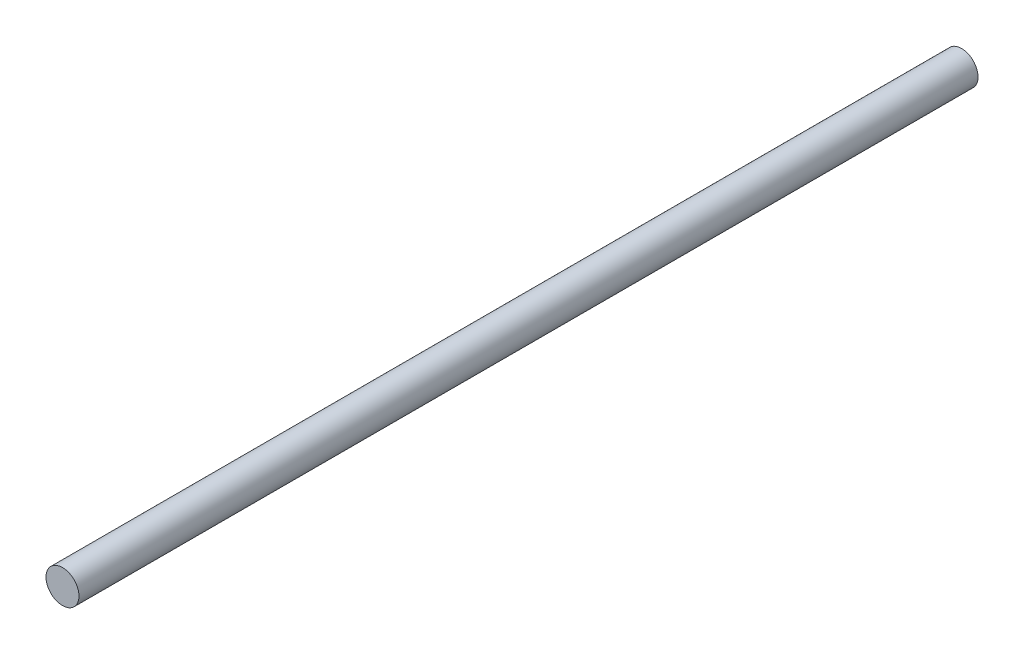
ISO-10303-21;
HEADER;
FILE_DESCRIPTION(('STEP AP214'),'2;1');
FILE_NAME('part.step','',(''),(''),'','','');
FILE_SCHEMA(('AUTOMOTIVE_DESIGN { 1 0 10303 214 1 1 1 1 }'));
ENDSEC;
DATA;
#1=APPLICATION_CONTEXT('core data for automotive mechanical design processes');
#2=APPLICATION_PROTOCOL_DEFINITION('international standard','automotive_design',2000,#1);
#3=PRODUCT_CONTEXT('',#1,'mechanical');
#4=PRODUCT('Part','Part','',(#3));
#5=PRODUCT_RELATED_PRODUCT_CATEGORY('part','',(#4));
#6=PRODUCT_DEFINITION_FORMATION('','',#4);
#7=PRODUCT_DEFINITION_CONTEXT('part definition',#1,'design');
#8=PRODUCT_DEFINITION('design','',#6,#7);
#9=PRODUCT_DEFINITION_SHAPE('','',#8);
#10=(LENGTH_UNIT() NAMED_UNIT(*) SI_UNIT(.MILLI.,.METRE.));
#11=(NAMED_UNIT(*) PLANE_ANGLE_UNIT() SI_UNIT($,.RADIAN.));
#12=(NAMED_UNIT(*) SI_UNIT($,.STERADIAN.) SOLID_ANGLE_UNIT());
#13=UNCERTAINTY_MEASURE_WITH_UNIT(LENGTH_MEASURE(1.E-05),#10,'distance_accuracy_value','');
#14=(GEOMETRIC_REPRESENTATION_CONTEXT(3) GLOBAL_UNCERTAINTY_ASSIGNED_CONTEXT((#13)) GLOBAL_UNIT_ASSIGNED_CONTEXT((#10,
#11,#12)) REPRESENTATION_CONTEXT('',''));
#15=CARTESIAN_POINT('',(0.,0.,0.));
#16=DIRECTION('',(0.,0.,1.));
#17=DIRECTION('',(1.,0.,0.));
#18=AXIS2_PLACEMENT_3D('',#15,#16,#17);
#19=CARTESIAN_POINT('',(0.,0.,38.1));
#20=DIRECTION('',(0.,0.,-1.));
#21=DIRECTION('',(-1.,0.,0.));
#22=AXIS2_PLACEMENT_3D('',#19,#20,#21);
#23=CYLINDRICAL_SURFACE('',#22,0.6985);
#24=CARTESIAN_POINT('',(0.,0.,38.1));
#25=DIRECTION('',(0.,0.,1.));
#26=DIRECTION('',(1.,0.,0.));
#27=AXIS2_PLACEMENT_3D('',#24,#25,#26);
#28=CIRCLE('',#27,0.6985);
#29=CARTESIAN_POINT('',(-0.6985,0.,38.1));
#30=VERTEX_POINT('',#29);
#31=EDGE_CURVE('E10',#30,#30,#28,.T.);
#32=CARTESIAN_POINT('',(0.,0.,0.));
#33=DIRECTION('',(0.,0.,1.));
#34=DIRECTION('',(1.,0.,0.));
#35=AXIS2_PLACEMENT_3D('',#32,#33,#34);
#36=CIRCLE('',#35,0.6985);
#37=CARTESIAN_POINT('',(-0.6985,0.,0.));
#38=VERTEX_POINT('',#37);
#39=EDGE_CURVE('E40',#38,#38,#36,.T.);
#40=CARTESIAN_POINT('',(-0.6985,0.,38.1));
#41=CARTESIAN_POINT('',(-0.6985,0.,37.703125));
#42=CARTESIAN_POINT('',(-0.6985,0.,37.30625));
#43=CARTESIAN_POINT('',(-0.6985,0.,36.5125));
#44=CARTESIAN_POINT('',(-0.6985,0.,36.115625));
#45=CARTESIAN_POINT('',(-0.6985,0.,35.321875));
#46=CARTESIAN_POINT('',(-0.6985,0.,34.925));
#47=CARTESIAN_POINT('',(-0.6985,0.,34.13125));
#48=CARTESIAN_POINT('',(-0.6985,0.,33.734375));
#49=CARTESIAN_POINT('',(-0.6985,0.,32.940625));
#50=CARTESIAN_POINT('',(-0.6985,0.,32.54375));
#51=CARTESIAN_POINT('',(-0.6985,0.,31.75));
#52=CARTESIAN_POINT('',(-0.6985,0.,31.353125));
#53=CARTESIAN_POINT('',(-0.6985,0.,30.559375));
#54=CARTESIAN_POINT('',(-0.6985,0.,30.1625));
#55=CARTESIAN_POINT('',(-0.6985,0.,29.36875));
#56=CARTESIAN_POINT('',(-0.6985,0.,28.971875));
#57=CARTESIAN_POINT('',(-0.6985,0.,28.178125));
#58=CARTESIAN_POINT('',(-0.6985,0.,27.78125));
#59=CARTESIAN_POINT('',(-0.6985,0.,26.9875));
#60=CARTESIAN_POINT('',(-0.6985,0.,26.590625));
#61=CARTESIAN_POINT('',(-0.6985,0.,25.796875));
#62=CARTESIAN_POINT('',(-0.6985,0.,25.4));
#63=CARTESIAN_POINT('',(-0.6985,0.,24.60625));
#64=CARTESIAN_POINT('',(-0.6985,0.,24.209375));
#65=CARTESIAN_POINT('',(-0.6985,0.,23.415625));
#66=CARTESIAN_POINT('',(-0.6985,0.,23.01875));
#67=CARTESIAN_POINT('',(-0.6985,0.,22.225));
#68=CARTESIAN_POINT('',(-0.6985,0.,21.828125));
#69=CARTESIAN_POINT('',(-0.6985,0.,21.034375));
#70=CARTESIAN_POINT('',(-0.6985,0.,20.6375));
#71=CARTESIAN_POINT('',(-0.6985,0.,19.84375));
#72=CARTESIAN_POINT('',(-0.6985,0.,19.446875));
#73=CARTESIAN_POINT('',(-0.6985,0.,18.653125));
#74=CARTESIAN_POINT('',(-0.6985,0.,18.25625));
#75=CARTESIAN_POINT('',(-0.6985,0.,17.4625));
#76=CARTESIAN_POINT('',(-0.6985,0.,17.065625));
#77=CARTESIAN_POINT('',(-0.6985,0.,16.271875));
#78=CARTESIAN_POINT('',(-0.6985,0.,15.875));
#79=CARTESIAN_POINT('',(-0.6985,0.,15.08125));
#80=CARTESIAN_POINT('',(-0.6985,0.,14.684375));
#81=CARTESIAN_POINT('',(-0.6985,0.,13.890625));
#82=CARTESIAN_POINT('',(-0.6985,0.,13.49375));
#83=CARTESIAN_POINT('',(-0.6985,0.,12.7));
#84=CARTESIAN_POINT('',(-0.6985,0.,12.303125));
#85=CARTESIAN_POINT('',(-0.6985,0.,11.509375));
#86=CARTESIAN_POINT('',(-0.6985,0.,11.1125));
#87=CARTESIAN_POINT('',(-0.6985,0.,10.31875));
#88=CARTESIAN_POINT('',(-0.6985,0.,9.92187499999999));
#89=CARTESIAN_POINT('',(-0.6985,0.,9.128125));
#90=CARTESIAN_POINT('',(-0.6985,0.,8.73124999999999));
#91=CARTESIAN_POINT('',(-0.6985,0.,7.93749999999999));
#92=CARTESIAN_POINT('',(-0.6985,0.,7.54062499999999));
#93=CARTESIAN_POINT('',(-0.6985,0.,6.746875));
#94=CARTESIAN_POINT('',(-0.6985,0.,6.35));
#95=CARTESIAN_POINT('',(-0.6985,0.,5.55625));
#96=CARTESIAN_POINT('',(-0.6985,0.,5.159375));
#97=CARTESIAN_POINT('',(-0.6985,0.,4.365625));
#98=CARTESIAN_POINT('',(-0.6985,0.,3.96875));
#99=CARTESIAN_POINT('',(-0.6985,0.,3.175));
#100=CARTESIAN_POINT('',(-0.6985,0.,2.778125));
#101=CARTESIAN_POINT('',(-0.6985,0.,1.984375));
#102=CARTESIAN_POINT('',(-0.6985,0.,1.5875));
#103=CARTESIAN_POINT('',(-0.6985,0.,0.79375));
#104=CARTESIAN_POINT('',(-0.6985,0.,0.396875));
#105=CARTESIAN_POINT('',(-0.6985,0.,0.));
#106=B_SPLINE_CURVE_WITH_KNOTS('',3,(#40,#41,#42,#43,#44,#45,#46,#47,#48,#49,#50,#51,#52,#53,
#54,#55,#56,#57,#58,#59,#60,#61,#62,#63,#64,#65,#66,#67,#68,#69,#70,#71,#72,#73,#74,#75,#76,#77,
#78,#79,#80,#81,#82,#83,#84,#85,#86,#87,#88,#89,#90,#91,#92,#93,#94,#95,#96,#97,#98,#99,#100,
#101,#102,#103,#104,#105),.UNSPECIFIED.,.F.,.F.,(4,2,2,2,2,2,2,2,2,2,2,2,2,2,2,2,2,2,2,2,2,2,2,
2,2,2,2,2,2,2,2,2,4),(0.,1.190625,2.38125,3.571875,4.7625,5.953125,7.14375,8.334375,
9.52500000000001,10.715625,11.90625,13.096875,14.2875,15.478125,16.66875,17.859375,19.05,
20.240625,21.43125,22.621875,23.8125,25.003125,26.19375,27.384375,28.575,29.765625,30.95625,
32.146875,33.3375,34.528125,35.71875,36.909375,38.1),.UNSPECIFIED.);
#107=EDGE_CURVE('BSEAM37',#30,#38,#106,.T.);
#108=ORIENTED_EDGE('',*,*,#31,.F.);
#109=ORIENTED_EDGE('',*,*,#39,.T.);
#110=ORIENTED_EDGE('',*,*,#107,.T.);
#111=ORIENTED_EDGE('',*,*,#107,.F.);
#112=EDGE_LOOP('',(#108,#110,#109,#111));
#113=FACE_BOUND('',#112,.T.);
#114=ADVANCED_FACE('F37',(#113),#23,.T.);
#115=CARTESIAN_POINT('',(0.,0.,38.1));
#116=DIRECTION('',(0.,0.,1.));
#117=DIRECTION('',(1.,0.,0.));
#118=AXIS2_PLACEMENT_3D('',#115,#116,#117);
#119=PLANE('',#118);
#120=ORIENTED_EDGE('',*,*,#31,.T.);
#121=EDGE_LOOP('',(#120));
#122=FACE_BOUND('',#121,.T.);
#123=ADVANCED_FACE('F52',(#122),#119,.T.);
#124=CARTESIAN_POINT('',(0.,0.,0.));
#125=DIRECTION('',(0.,0.,1.));
#126=DIRECTION('',(1.,0.,0.));
#127=AXIS2_PLACEMENT_3D('',#124,#125,#126);
#128=PLANE('',#127);
#129=ORIENTED_EDGE('',*,*,#39,.F.);
#130=EDGE_LOOP('',(#129));
#131=FACE_BOUND('',#130,.T.);
#132=ADVANCED_FACE('F50',(#131),#128,.F.);
#133=CLOSED_SHELL('',(#114,#123,#132));
#134=MANIFOLD_SOLID_BREP('B2',#133);
#135=ADVANCED_BREP_SHAPE_REPRESENTATION('',(#18,#134),#14);
#136=SHAPE_DEFINITION_REPRESENTATION(#9,#135);
ENDSEC;
END-ISO-10303-21;
